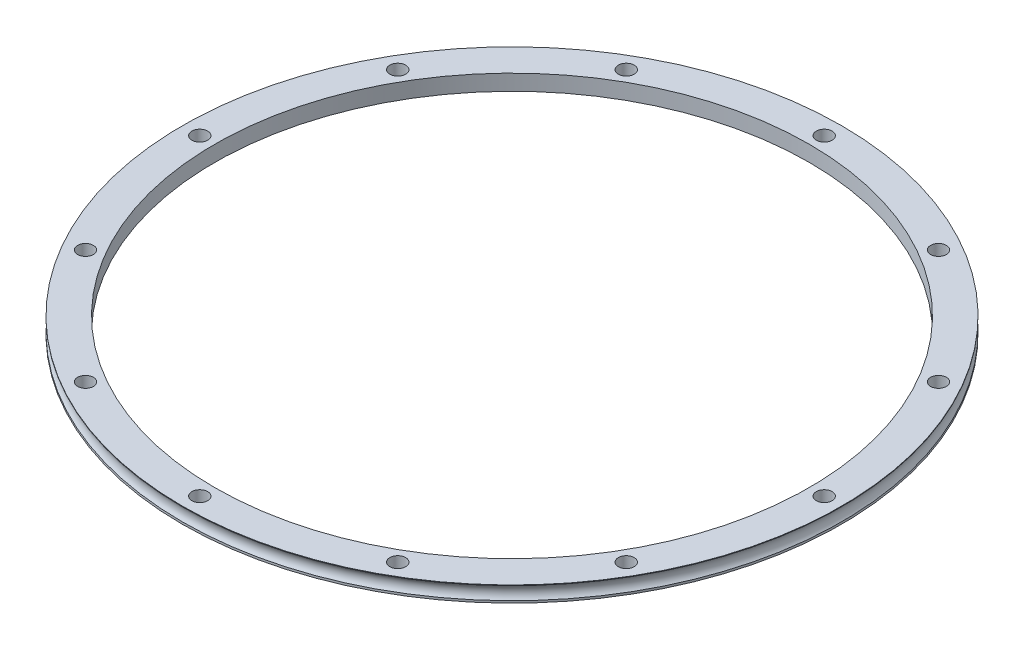
ISO-10303-21;
HEADER;
FILE_DESCRIPTION(('STEP AP214'),'2;1');
FILE_NAME('part.step','',(''),(''),'','','');
FILE_SCHEMA(('AUTOMOTIVE_DESIGN { 1 0 10303 214 1 1 1 1 }'));
ENDSEC;
DATA;
#1=APPLICATION_CONTEXT('core data for automotive mechanical design processes');
#2=APPLICATION_PROTOCOL_DEFINITION('international standard','automotive_design',2000,#1);
#3=PRODUCT_CONTEXT('',#1,'mechanical');
#4=PRODUCT('Part','Part','',(#3));
#5=PRODUCT_RELATED_PRODUCT_CATEGORY('part','',(#4));
#6=PRODUCT_DEFINITION_FORMATION('','',#4);
#7=PRODUCT_DEFINITION_CONTEXT('part definition',#1,'design');
#8=PRODUCT_DEFINITION('design','',#6,#7);
#9=PRODUCT_DEFINITION_SHAPE('','',#8);
#10=(LENGTH_UNIT() NAMED_UNIT(*) SI_UNIT(.MILLI.,.METRE.));
#11=(NAMED_UNIT(*) PLANE_ANGLE_UNIT() SI_UNIT($,.RADIAN.));
#12=(NAMED_UNIT(*) SI_UNIT($,.STERADIAN.) SOLID_ANGLE_UNIT());
#13=UNCERTAINTY_MEASURE_WITH_UNIT(LENGTH_MEASURE(1.E-05),#10,'distance_accuracy_value','');
#14=(GEOMETRIC_REPRESENTATION_CONTEXT(3) GLOBAL_UNCERTAINTY_ASSIGNED_CONTEXT((#13)) GLOBAL_UNIT_ASSIGNED_CONTEXT((#10,
#11,#12)) REPRESENTATION_CONTEXT('',''));
#15=CARTESIAN_POINT('',(0.,0.,0.));
#16=DIRECTION('',(0.,0.,1.));
#17=DIRECTION('',(1.,0.,0.));
#18=AXIS2_PLACEMENT_3D('',#15,#16,#17);
#19=CARTESIAN_POINT('',(0.,8.53500000000001,0.));
#20=DIRECTION('',(0.,-1.,0.));
#21=DIRECTION('',(0.,0.,-1.));
#22=AXIS2_PLACEMENT_3D('',#19,#20,#21);
#23=TOROIDAL_SURFACE('',#22,67.984375,1.984375);
#24=CARTESIAN_POINT('',(0.,7.21804328088638,0.));
#25=DIRECTION('',(0.,-1.,0.));
#26=DIRECTION('',(0.,0.,-1.));
#27=AXIS2_PLACEMENT_3D('',#24,#25,#26);
#28=CIRCLE('',#27,66.5);
#29=CARTESIAN_POINT('',(0.,7.21804328088638,-66.5));
#30=VERTEX_POINT('',#29);
#31=EDGE_CURVE('E10',#30,#30,#28,.T.);
#32=ORIENTED_EDGE('',*,*,#31,.F.);
#33=EDGE_LOOP('',(#32));
#34=FACE_BOUND('',#33,.T.);
#35=CARTESIAN_POINT('',(0.,9.85195671910333,0.));
#36=DIRECTION('',(0.,-1.,0.));
#37=DIRECTION('',(0.,0.,-1.));
#38=AXIS2_PLACEMENT_3D('',#35,#36,#37);
#39=CIRCLE('',#38,66.5);
#40=CARTESIAN_POINT('',(0.,9.85195671910333,-66.5));
#41=VERTEX_POINT('',#40);
#42=EDGE_CURVE('E59',#41,#41,#39,.T.);
#43=ORIENTED_EDGE('',*,*,#42,.T.);
#44=EDGE_LOOP('',(#43));
#45=FACE_BOUND('',#44,.T.);
#46=ADVANCED_FACE('F37',(#34,#45),#23,.F.);
#47=CARTESIAN_POINT('',(0.,-200069.047495165,0.));
#48=DIRECTION('',(0.,-1.,0.));
#49=DIRECTION('',(0.,0.,-1.));
#50=AXIS2_PLACEMENT_3D('',#47,#48,#49);
#51=CYLINDRICAL_SURFACE('',#50,66.5);
#52=CARTESIAN_POINT('',(0.,6.78500000000781,0.));
#53=DIRECTION('',(0.,-1.,0.));
#54=DIRECTION('',(0.,0.,-1.));
#55=AXIS2_PLACEMENT_3D('',#52,#53,#54);
#56=CIRCLE('',#55,66.5);
#57=CARTESIAN_POINT('',(0.,6.78500000000781,-66.5));
#58=VERTEX_POINT('',#57);
#59=EDGE_CURVE('E43',#58,#58,#56,.T.);
#60=ORIENTED_EDGE('',*,*,#59,.F.);
#61=EDGE_LOOP('',(#60));
#62=FACE_BOUND('',#61,.T.);
#63=ORIENTED_EDGE('',*,*,#31,.T.);
#64=EDGE_LOOP('',(#63));
#65=FACE_BOUND('',#64,.T.);
#66=ADVANCED_FACE('F169',(#62,#65),#51,.T.);
#67=CARTESIAN_POINT('',(-60.,6.785,0.));
#68=DIRECTION('',(0.,1.,0.));
#69=DIRECTION('',(0.,0.,1.));
#70=AXIS2_PLACEMENT_3D('',#67,#68,#69);
#71=PLANE('',#70);
#72=CARTESIAN_POINT('',(-54.5596004384197,6.78500000000781,-31.4999999999999));
#73=DIRECTION('',(0.,1.,0.));
#74=DIRECTION('',(0.86602540378444,0.,0.499999999999998));
#75=AXIS2_PLACEMENT_3D('',#72,#73,#74);
#76=CIRCLE('',#75,1.6);
#77=CARTESIAN_POINT('',(-53.1739597923646,6.78500000000781,-30.6999999999999));
#78=VERTEX_POINT('',#77);
#79=EDGE_CURVE('E72',#78,#78,#76,.T.);
#80=ORIENTED_EDGE('',*,*,#79,.T.);
#81=EDGE_LOOP('',(#80));
#82=FACE_BOUND('',#81,.T.);
#83=CARTESIAN_POINT('',(-63.,6.78500000000781,2.19963324347117E-13));
#84=DIRECTION('',(0.,1.,0.));
#85=DIRECTION('',(1.,0.,0.));
#86=AXIS2_PLACEMENT_3D('',#83,#84,#85);
#87=CIRCLE('',#86,1.6);
#88=CARTESIAN_POINT('',(-61.4,6.78500000000781,2.14376954204968E-13));
#89=VERTEX_POINT('',#88);
#90=EDGE_CURVE('E115',#89,#89,#87,.T.);
#91=ORIENTED_EDGE('',*,*,#90,.T.);
#92=EDGE_LOOP('',(#91));
#93=FACE_BOUND('',#92,.T.);
#94=CARTESIAN_POINT('',(-54.5596004384195,6.78500000000781,31.5000000000003));
#95=DIRECTION('',(0.,1.,0.));
#96=DIRECTION('',(0.866025403784436,0.,-0.500000000000004));
#97=AXIS2_PLACEMENT_3D('',#94,#95,#96);
#98=CIRCLE('',#97,1.6);
#99=CARTESIAN_POINT('',(-53.1739597923644,6.78500000000781,30.7000000000002));
#100=VERTEX_POINT('',#99);
#101=EDGE_CURVE('E109',#100,#100,#98,.T.);
#102=ORIENTED_EDGE('',*,*,#101,.T.);
#103=EDGE_LOOP('',(#102));
#104=FACE_BOUND('',#103,.T.);
#105=CARTESIAN_POINT('',(-31.4999999999997,6.78500000000781,54.5596004384198));
#106=DIRECTION('',(0.,1.,0.));
#107=DIRECTION('',(0.499999999999995,0.,-0.866025403784442));
#108=AXIS2_PLACEMENT_3D('',#105,#106,#107);
#109=CIRCLE('',#108,1.6);
#110=CARTESIAN_POINT('',(-30.6999999999997,6.78500000000781,53.1739597923647));
#111=VERTEX_POINT('',#110);
#112=EDGE_CURVE('E103',#111,#111,#109,.T.);
#113=ORIENTED_EDGE('',*,*,#112,.T.);
#114=EDGE_LOOP('',(#113));
#115=FACE_BOUND('',#114,.T.);
#116=CARTESIAN_POINT('',(0.,6.78500000000781,63.));
#117=DIRECTION('',(0.,1.,0.));
#118=DIRECTION('',(0.,0.,-1.));
#119=AXIS2_PLACEMENT_3D('',#116,#117,#118);
#120=CIRCLE('',#119,1.6);
#121=CARTESIAN_POINT('',(0.,6.78500000000781,61.4));
#122=VERTEX_POINT('',#121);
#123=EDGE_CURVE('E97',#122,#122,#120,.T.);
#124=ORIENTED_EDGE('',*,*,#123,.T.);
#125=EDGE_LOOP('',(#124));
#126=FACE_BOUND('',#125,.T.);
#127=CARTESIAN_POINT('',(31.5000000000005,6.78500000000781,54.5596004384194));
#128=DIRECTION('',(0.,1.,0.));
#129=DIRECTION('',(-0.500000000000007,0.,-0.866025403784435));
#130=AXIS2_PLACEMENT_3D('',#127,#128,#129);
#131=CIRCLE('',#130,1.6);
#132=CARTESIAN_POINT('',(30.7000000000004,6.78500000000781,53.1739597923643));
#133=VERTEX_POINT('',#132);
#134=EDGE_CURVE('E91',#133,#133,#131,.T.);
#135=ORIENTED_EDGE('',*,*,#134,.T.);
#136=EDGE_LOOP('',(#135));
#137=FACE_BOUND('',#136,.T.);
#138=CARTESIAN_POINT('',(54.5596004384199,6.78500000000781,31.4999999999995));
#139=DIRECTION('',(0.,1.,0.));
#140=DIRECTION('',(-0.866025403784443,0.,-0.499999999999992));
#141=AXIS2_PLACEMENT_3D('',#138,#139,#140);
#142=CIRCLE('',#141,1.6);
#143=CARTESIAN_POINT('',(53.1739597923648,6.78500000000781,30.6999999999995));
#144=VERTEX_POINT('',#143);
#145=EDGE_CURVE('E85',#144,#144,#142,.T.);
#146=ORIENTED_EDGE('',*,*,#145,.T.);
#147=EDGE_LOOP('',(#146));
#148=FACE_BOUND('',#147,.T.);
#149=CARTESIAN_POINT('',(63.,6.78500000000781,-6.59889973041352E-13));
#150=DIRECTION('',(0.,1.,0.));
#151=DIRECTION('',(-1.,0.,0.));
#152=AXIS2_PLACEMENT_3D('',#149,#150,#151);
#153=CIRCLE('',#152,1.6);
#154=CARTESIAN_POINT('',(61.4,6.78500000000781,-6.43130862614905E-13));
#155=VERTEX_POINT('',#154);
#156=EDGE_CURVE('E78',#155,#155,#153,.T.);
#157=ORIENTED_EDGE('',*,*,#156,.T.);
#158=EDGE_LOOP('',(#157));
#159=FACE_BOUND('',#158,.T.);
#160=CARTESIAN_POINT('',(54.5596004384193,6.78500000000781,-31.5000000000006));
#161=DIRECTION('',(0.,1.,0.));
#162=DIRECTION('',(-0.866025403784433,0.,0.50000000000001));
#163=AXIS2_PLACEMENT_3D('',#160,#161,#162);
#164=CIRCLE('',#163,1.6);
#165=CARTESIAN_POINT('',(53.1739597923642,6.78500000000781,-30.7000000000006));
#166=VERTEX_POINT('',#165);
#167=EDGE_CURVE('E79',#166,#166,#164,.T.);
#168=ORIENTED_EDGE('',*,*,#167,.T.);
#169=EDGE_LOOP('',(#168));
#170=FACE_BOUND('',#169,.T.);
#171=CARTESIAN_POINT('',(31.4999999999993,6.78500000000781,-54.55960043842));
#172=DIRECTION('',(0.,1.,0.));
#173=DIRECTION('',(-0.499999999999989,0.,0.866025403784445));
#174=AXIS2_PLACEMENT_3D('',#171,#172,#173);
#175=CIRCLE('',#174,1.6);
#176=CARTESIAN_POINT('',(30.6999999999993,6.78500000000781,-53.1739597923649));
#177=VERTEX_POINT('',#176);
#178=EDGE_CURVE('E126',#177,#177,#175,.T.);
#179=ORIENTED_EDGE('',*,*,#178,.T.);
#180=EDGE_LOOP('',(#179));
#181=FACE_BOUND('',#180,.T.);
#182=CARTESIAN_POINT('',(-31.5000000000001,6.78500000000781,-54.5596004384196));
#183=DIRECTION('',(0.,1.,0.));
#184=DIRECTION('',(0.500000000000001,0.,0.866025403784438));
#185=AXIS2_PLACEMENT_3D('',#182,#183,#184);
#186=CIRCLE('',#185,1.6);
#187=CARTESIAN_POINT('',(-30.7000000000001,6.78500000000781,-53.1739597923645));
#188=VERTEX_POINT('',#187);
#189=EDGE_CURVE('E66',#188,#188,#186,.T.);
#190=ORIENTED_EDGE('',*,*,#189,.T.);
#191=EDGE_LOOP('',(#190));
#192=FACE_BOUND('',#191,.T.);
#193=CARTESIAN_POINT('',(0.,6.78500000000781,-63.));
#194=DIRECTION('',(0.,1.,0.));
#195=DIRECTION('',(0.,0.,1.));
#196=AXIS2_PLACEMENT_3D('',#193,#194,#195);
#197=CIRCLE('',#196,1.6);
#198=CARTESIAN_POINT('',(0.,6.78500000000781,-61.4));
#199=VERTEX_POINT('',#198);
#200=EDGE_CURVE('E62',#199,#199,#197,.T.);
#201=ORIENTED_EDGE('',*,*,#200,.T.);
#202=EDGE_LOOP('',(#201));
#203=FACE_BOUND('',#202,.T.);
#204=CARTESIAN_POINT('',(0.,6.78500000000781,0.));
#205=DIRECTION('',(0.,-1.,0.));
#206=DIRECTION('',(0.,0.,-1.));
#207=AXIS2_PLACEMENT_3D('',#204,#205,#206);
#208=CIRCLE('',#207,60.);
#209=CARTESIAN_POINT('',(0.,6.78500000000781,-60.));
#210=VERTEX_POINT('',#209);
#211=EDGE_CURVE('E47',#210,#210,#208,.T.);
#212=ORIENTED_EDGE('',*,*,#211,.F.);
#213=EDGE_LOOP('',(#212));
#214=FACE_BOUND('',#213,.T.);
#215=ORIENTED_EDGE('',*,*,#59,.T.);
#216=EDGE_LOOP('',(#215));
#217=FACE_BOUND('',#216,.T.);
#218=ADVANCED_FACE('F135',(#82,#93,#104,#115,#126,#137,#148,#159,#170,#181,#192,#203,#214,#217),
#71,.F.);
#219=CARTESIAN_POINT('',(0.,-200069.047495165,0.));
#220=DIRECTION('',(0.,-1.,0.));
#221=DIRECTION('',(0.,0.,-1.));
#222=AXIS2_PLACEMENT_3D('',#219,#220,#221);
#223=CYLINDRICAL_SURFACE('',#222,60.);
#224=CARTESIAN_POINT('',(0.,9.96499999999401,0.));
#225=DIRECTION('',(0.,-1.,0.));
#226=DIRECTION('',(0.,0.,-1.));
#227=AXIS2_PLACEMENT_3D('',#224,#225,#226);
#228=CIRCLE('',#227,60.);
#229=CARTESIAN_POINT('',(0.,9.96499999999401,-60.));
#230=VERTEX_POINT('',#229);
#231=EDGE_CURVE('E51',#230,#230,#228,.T.);
#232=ORIENTED_EDGE('',*,*,#231,.F.);
#233=EDGE_LOOP('',(#232));
#234=FACE_BOUND('',#233,.T.);
#235=ORIENTED_EDGE('',*,*,#211,.T.);
#236=EDGE_LOOP('',(#235));
#237=FACE_BOUND('',#236,.T.);
#238=ADVANCED_FACE('F150',(#234,#237),#223,.F.);
#239=CARTESIAN_POINT('',(-60.,9.965,0.));
#240=DIRECTION('',(0.,-1.,0.));
#241=DIRECTION('',(0.,0.,-1.));
#242=AXIS2_PLACEMENT_3D('',#239,#240,#241);
#243=PLANE('',#242);
#244=CARTESIAN_POINT('',(-54.5596004384197,9.965,-31.4999999999999));
#245=DIRECTION('',(0.,1.,0.));
#246=DIRECTION('',(0.86602540378444,0.,0.499999999999998));
#247=AXIS2_PLACEMENT_3D('',#244,#245,#246);
#248=CIRCLE('',#247,1.6);
#249=CARTESIAN_POINT('',(-53.1739597923646,9.965,-30.6999999999999));
#250=VERTEX_POINT('',#249);
#251=EDGE_CURVE('E118',#250,#250,#248,.T.);
#252=ORIENTED_EDGE('',*,*,#251,.F.);
#253=EDGE_LOOP('',(#252));
#254=FACE_BOUND('',#253,.T.);
#255=CARTESIAN_POINT('',(-63.,9.965,2.19963324347117E-13));
#256=DIRECTION('',(0.,1.,0.));
#257=DIRECTION('',(1.,0.,0.));
#258=AXIS2_PLACEMENT_3D('',#255,#256,#257);
#259=CIRCLE('',#258,1.6);
#260=CARTESIAN_POINT('',(-61.4,9.965,2.14376954204968E-13));
#261=VERTEX_POINT('',#260);
#262=EDGE_CURVE('E112',#261,#261,#259,.T.);
#263=ORIENTED_EDGE('',*,*,#262,.F.);
#264=EDGE_LOOP('',(#263));
#265=FACE_BOUND('',#264,.T.);
#266=CARTESIAN_POINT('',(-54.5596004384195,9.965,31.5000000000003));
#267=DIRECTION('',(0.,1.,0.));
#268=DIRECTION('',(0.866025403784436,0.,-0.500000000000004));
#269=AXIS2_PLACEMENT_3D('',#266,#267,#268);
#270=CIRCLE('',#269,1.6);
#271=CARTESIAN_POINT('',(-53.1739597923644,9.965,30.7000000000002));
#272=VERTEX_POINT('',#271);
#273=EDGE_CURVE('E106',#272,#272,#270,.T.);
#274=ORIENTED_EDGE('',*,*,#273,.F.);
#275=EDGE_LOOP('',(#274));
#276=FACE_BOUND('',#275,.T.);
#277=CARTESIAN_POINT('',(-31.4999999999997,9.965,54.5596004384198));
#278=DIRECTION('',(0.,1.,0.));
#279=DIRECTION('',(0.499999999999995,0.,-0.866025403784442));
#280=AXIS2_PLACEMENT_3D('',#277,#278,#279);
#281=CIRCLE('',#280,1.6);
#282=CARTESIAN_POINT('',(-30.6999999999997,9.965,53.1739597923647));
#283=VERTEX_POINT('',#282);
#284=EDGE_CURVE('E100',#283,#283,#281,.T.);
#285=ORIENTED_EDGE('',*,*,#284,.F.);
#286=EDGE_LOOP('',(#285));
#287=FACE_BOUND('',#286,.T.);
#288=CARTESIAN_POINT('',(0.,9.965,63.));
#289=DIRECTION('',(0.,1.,0.));
#290=DIRECTION('',(0.,0.,-1.));
#291=AXIS2_PLACEMENT_3D('',#288,#289,#290);
#292=CIRCLE('',#291,1.6);
#293=CARTESIAN_POINT('',(0.,9.965,61.4));
#294=VERTEX_POINT('',#293);
#295=EDGE_CURVE('E94',#294,#294,#292,.T.);
#296=ORIENTED_EDGE('',*,*,#295,.F.);
#297=EDGE_LOOP('',(#296));
#298=FACE_BOUND('',#297,.T.);
#299=CARTESIAN_POINT('',(31.5000000000005,9.965,54.5596004384194));
#300=DIRECTION('',(0.,1.,0.));
#301=DIRECTION('',(-0.500000000000007,0.,-0.866025403784435));
#302=AXIS2_PLACEMENT_3D('',#299,#300,#301);
#303=CIRCLE('',#302,1.6);
#304=CARTESIAN_POINT('',(30.7000000000004,9.965,53.1739597923643));
#305=VERTEX_POINT('',#304);
#306=EDGE_CURVE('E88',#305,#305,#303,.T.);
#307=ORIENTED_EDGE('',*,*,#306,.F.);
#308=EDGE_LOOP('',(#307));
#309=FACE_BOUND('',#308,.T.);
#310=CARTESIAN_POINT('',(54.5596004384199,9.965,31.4999999999995));
#311=DIRECTION('',(0.,1.,0.));
#312=DIRECTION('',(-0.866025403784443,0.,-0.499999999999992));
#313=AXIS2_PLACEMENT_3D('',#310,#311,#312);
#314=CIRCLE('',#313,1.6);
#315=CARTESIAN_POINT('',(53.1739597923648,9.965,30.6999999999995));
#316=VERTEX_POINT('',#315);
#317=EDGE_CURVE('E82',#316,#316,#314,.T.);
#318=ORIENTED_EDGE('',*,*,#317,.F.);
#319=EDGE_LOOP('',(#318));
#320=FACE_BOUND('',#319,.T.);
#321=CARTESIAN_POINT('',(63.,9.965,-6.59889973041352E-13));
#322=DIRECTION('',(0.,1.,0.));
#323=DIRECTION('',(-1.,0.,0.));
#324=AXIS2_PLACEMENT_3D('',#321,#322,#323);
#325=CIRCLE('',#324,1.6);
#326=CARTESIAN_POINT('',(61.4,9.965,-6.43130862614905E-13));
#327=VERTEX_POINT('',#326);
#328=EDGE_CURVE('E75',#327,#327,#325,.T.);
#329=ORIENTED_EDGE('',*,*,#328,.F.);
#330=EDGE_LOOP('',(#329));
#331=FACE_BOUND('',#330,.T.);
#332=CARTESIAN_POINT('',(54.5596004384193,9.965,-31.5000000000006));
#333=DIRECTION('',(0.,1.,0.));
#334=DIRECTION('',(-0.866025403784433,0.,0.50000000000001));
#335=AXIS2_PLACEMENT_3D('',#332,#333,#334);
#336=CIRCLE('',#335,1.6);
#337=CARTESIAN_POINT('',(53.1739597923642,9.965,-30.7000000000006));
#338=VERTEX_POINT('',#337);
#339=EDGE_CURVE('E129',#338,#338,#336,.T.);
#340=ORIENTED_EDGE('',*,*,#339,.F.);
#341=EDGE_LOOP('',(#340));
#342=FACE_BOUND('',#341,.T.);
#343=CARTESIAN_POINT('',(31.4999999999993,9.965,-54.55960043842));
#344=DIRECTION('',(0.,1.,0.));
#345=DIRECTION('',(-0.499999999999989,0.,0.866025403784445));
#346=AXIS2_PLACEMENT_3D('',#343,#344,#345);
#347=CIRCLE('',#346,1.6);
#348=CARTESIAN_POINT('',(30.6999999999993,9.965,-53.1739597923649));
#349=VERTEX_POINT('',#348);
#350=EDGE_CURVE('E123',#349,#349,#347,.T.);
#351=ORIENTED_EDGE('',*,*,#350,.F.);
#352=EDGE_LOOP('',(#351));
#353=FACE_BOUND('',#352,.T.);
#354=CARTESIAN_POINT('',(-31.5000000000001,9.965,-54.5596004384196));
#355=DIRECTION('',(0.,1.,0.));
#356=DIRECTION('',(0.500000000000001,0.,0.866025403784438));
#357=AXIS2_PLACEMENT_3D('',#354,#355,#356);
#358=CIRCLE('',#357,1.6);
#359=CARTESIAN_POINT('',(-30.7000000000001,9.965,-53.1739597923645));
#360=VERTEX_POINT('',#359);
#361=EDGE_CURVE('E69',#360,#360,#358,.T.);
#362=ORIENTED_EDGE('',*,*,#361,.F.);
#363=EDGE_LOOP('',(#362));
#364=FACE_BOUND('',#363,.T.);
#365=CARTESIAN_POINT('',(0.,9.965,-63.));
#366=DIRECTION('',(0.,1.,0.));
#367=DIRECTION('',(0.,0.,1.));
#368=AXIS2_PLACEMENT_3D('',#365,#366,#367);
#369=CIRCLE('',#368,1.6);
#370=CARTESIAN_POINT('',(0.,9.965,-61.4));
#371=VERTEX_POINT('',#370);
#372=EDGE_CURVE('E63',#371,#371,#369,.T.);
#373=ORIENTED_EDGE('',*,*,#372,.F.);
#374=EDGE_LOOP('',(#373));
#375=FACE_BOUND('',#374,.T.);
#376=CARTESIAN_POINT('',(0.,9.96499999999401,0.));
#377=DIRECTION('',(0.,-1.,0.));
#378=DIRECTION('',(0.,0.,-1.));
#379=AXIS2_PLACEMENT_3D('',#376,#377,#378);
#380=CIRCLE('',#379,66.5);
#381=CARTESIAN_POINT('',(0.,9.96499999999401,-66.5));
#382=VERTEX_POINT('',#381);
#383=EDGE_CURVE('E56',#382,#382,#380,.T.);
#384=ORIENTED_EDGE('',*,*,#383,.F.);
#385=EDGE_LOOP('',(#384));
#386=FACE_BOUND('',#385,.T.);
#387=ORIENTED_EDGE('',*,*,#231,.T.);
#388=EDGE_LOOP('',(#387));
#389=FACE_BOUND('',#388,.T.);
#390=ADVANCED_FACE('F146',(#254,#265,#276,#287,#298,#309,#320,#331,#342,#353,#364,#375,#386,
#389),#243,.F.);
#391=CARTESIAN_POINT('',(0.,-200069.047495165,0.));
#392=DIRECTION('',(0.,-1.,0.));
#393=DIRECTION('',(0.,0.,-1.));
#394=AXIS2_PLACEMENT_3D('',#391,#392,#393);
#395=CYLINDRICAL_SURFACE('',#394,66.5);
#396=ORIENTED_EDGE('',*,*,#42,.F.);
#397=EDGE_LOOP('',(#396));
#398=FACE_BOUND('',#397,.T.);
#399=ORIENTED_EDGE('',*,*,#383,.T.);
#400=EDGE_LOOP('',(#399));
#401=FACE_BOUND('',#400,.T.);
#402=ADVANCED_FACE('F149',(#398,#401),#395,.T.);
#403=CARTESIAN_POINT('',(0.,6.78500000000781,-63.));
#404=DIRECTION('',(0.,1.,0.));
#405=DIRECTION('',(0.,0.,1.));
#406=AXIS2_PLACEMENT_3D('',#403,#404,#405);
#407=CYLINDRICAL_SURFACE('',#406,1.6);
#408=ORIENTED_EDGE('',*,*,#200,.F.);
#409=EDGE_LOOP('',(#408));
#410=FACE_BOUND('',#409,.T.);
#411=ORIENTED_EDGE('',*,*,#372,.T.);
#412=EDGE_LOOP('',(#411));
#413=FACE_BOUND('',#412,.T.);
#414=ADVANCED_FACE('F187',(#410,#413),#407,.F.);
#415=CARTESIAN_POINT('',(-31.5000000000001,6.78500000000781,-54.5596004384196));
#416=DIRECTION('',(0.,1.,0.));
#417=DIRECTION('',(0.,0.,1.));
#418=AXIS2_PLACEMENT_3D('',#415,#416,#417);
#419=CYLINDRICAL_SURFACE('',#418,1.6);
#420=ORIENTED_EDGE('',*,*,#189,.F.);
#421=EDGE_LOOP('',(#420));
#422=FACE_BOUND('',#421,.T.);
#423=ORIENTED_EDGE('',*,*,#361,.T.);
#424=EDGE_LOOP('',(#423));
#425=FACE_BOUND('',#424,.T.);
#426=ADVANCED_FACE('F191',(#422,#425),#419,.F.);
#427=CARTESIAN_POINT('',(31.4999999999993,6.78500000000781,-54.55960043842));
#428=DIRECTION('',(0.,1.,0.));
#429=DIRECTION('',(0.,0.,1.));
#430=AXIS2_PLACEMENT_3D('',#427,#428,#429);
#431=CYLINDRICAL_SURFACE('',#430,1.6);
#432=ORIENTED_EDGE('',*,*,#178,.F.);
#433=EDGE_LOOP('',(#432));
#434=FACE_BOUND('',#433,.T.);
#435=ORIENTED_EDGE('',*,*,#350,.T.);
#436=EDGE_LOOP('',(#435));
#437=FACE_BOUND('',#436,.T.);
#438=ADVANCED_FACE('F142',(#434,#437),#431,.F.);
#439=CARTESIAN_POINT('',(54.5596004384193,6.78500000000781,-31.5000000000006));
#440=DIRECTION('',(0.,1.,0.));
#441=DIRECTION('',(0.,0.,1.));
#442=AXIS2_PLACEMENT_3D('',#439,#440,#441);
#443=CYLINDRICAL_SURFACE('',#442,1.6);
#444=ORIENTED_EDGE('',*,*,#167,.F.);
#445=EDGE_LOOP('',(#444));
#446=FACE_BOUND('',#445,.T.);
#447=ORIENTED_EDGE('',*,*,#339,.T.);
#448=EDGE_LOOP('',(#447));
#449=FACE_BOUND('',#448,.T.);
#450=ADVANCED_FACE('F138',(#446,#449),#443,.F.);
#451=CARTESIAN_POINT('',(63.,6.78500000000781,-6.59889973041352E-13));
#452=DIRECTION('',(0.,1.,0.));
#453=DIRECTION('',(0.,0.,1.));
#454=AXIS2_PLACEMENT_3D('',#451,#452,#453);
#455=CYLINDRICAL_SURFACE('',#454,1.6);
#456=ORIENTED_EDGE('',*,*,#156,.F.);
#457=EDGE_LOOP('',(#456));
#458=FACE_BOUND('',#457,.T.);
#459=ORIENTED_EDGE('',*,*,#328,.T.);
#460=EDGE_LOOP('',(#459));
#461=FACE_BOUND('',#460,.T.);
#462=ADVANCED_FACE('F141',(#458,#461),#455,.F.);
#463=CARTESIAN_POINT('',(54.5596004384199,6.78500000000781,31.4999999999995));
#464=DIRECTION('',(0.,1.,0.));
#465=DIRECTION('',(0.,0.,1.));
#466=AXIS2_PLACEMENT_3D('',#463,#464,#465);
#467=CYLINDRICAL_SURFACE('',#466,1.6);
#468=ORIENTED_EDGE('',*,*,#145,.F.);
#469=EDGE_LOOP('',(#468));
#470=FACE_BOUND('',#469,.T.);
#471=ORIENTED_EDGE('',*,*,#317,.T.);
#472=EDGE_LOOP('',(#471));
#473=FACE_BOUND('',#472,.T.);
#474=ADVANCED_FACE('F200',(#470,#473),#467,.F.);
#475=CARTESIAN_POINT('',(31.5000000000005,6.78500000000781,54.5596004384194));
#476=DIRECTION('',(0.,1.,0.));
#477=DIRECTION('',(0.,0.,1.));
#478=AXIS2_PLACEMENT_3D('',#475,#476,#477);
#479=CYLINDRICAL_SURFACE('',#478,1.6);
#480=ORIENTED_EDGE('',*,*,#134,.F.);
#481=EDGE_LOOP('',(#480));
#482=FACE_BOUND('',#481,.T.);
#483=ORIENTED_EDGE('',*,*,#306,.T.);
#484=EDGE_LOOP('',(#483));
#485=FACE_BOUND('',#484,.T.);
#486=ADVANCED_FACE('F204',(#482,#485),#479,.F.);
#487=CARTESIAN_POINT('',(0.,6.78500000000781,63.));
#488=DIRECTION('',(0.,1.,0.));
#489=DIRECTION('',(0.,0.,1.));
#490=AXIS2_PLACEMENT_3D('',#487,#488,#489);
#491=CYLINDRICAL_SURFACE('',#490,1.6);
#492=ORIENTED_EDGE('',*,*,#123,.F.);
#493=EDGE_LOOP('',(#492));
#494=FACE_BOUND('',#493,.T.);
#495=ORIENTED_EDGE('',*,*,#295,.T.);
#496=EDGE_LOOP('',(#495));
#497=FACE_BOUND('',#496,.T.);
#498=ADVANCED_FACE('F208',(#494,#497),#491,.F.);
#499=CARTESIAN_POINT('',(-31.4999999999997,6.78500000000781,54.5596004384198));
#500=DIRECTION('',(0.,1.,0.));
#501=DIRECTION('',(0.,0.,1.));
#502=AXIS2_PLACEMENT_3D('',#499,#500,#501);
#503=CYLINDRICAL_SURFACE('',#502,1.6);
#504=ORIENTED_EDGE('',*,*,#112,.F.);
#505=EDGE_LOOP('',(#504));
#506=FACE_BOUND('',#505,.T.);
#507=ORIENTED_EDGE('',*,*,#284,.T.);
#508=EDGE_LOOP('',(#507));
#509=FACE_BOUND('',#508,.T.);
#510=ADVANCED_FACE('F212',(#506,#509),#503,.F.);
#511=CARTESIAN_POINT('',(-54.5596004384195,6.78500000000781,31.5000000000003));
#512=DIRECTION('',(0.,1.,0.));
#513=DIRECTION('',(0.,0.,1.));
#514=AXIS2_PLACEMENT_3D('',#511,#512,#513);
#515=CYLINDRICAL_SURFACE('',#514,1.6);
#516=ORIENTED_EDGE('',*,*,#101,.F.);
#517=EDGE_LOOP('',(#516));
#518=FACE_BOUND('',#517,.T.);
#519=ORIENTED_EDGE('',*,*,#273,.T.);
#520=EDGE_LOOP('',(#519));
#521=FACE_BOUND('',#520,.T.);
#522=ADVANCED_FACE('F216',(#518,#521),#515,.F.);
#523=CARTESIAN_POINT('',(-63.,6.78500000000781,2.19963324347117E-13));
#524=DIRECTION('',(0.,1.,0.));
#525=DIRECTION('',(0.,0.,1.));
#526=AXIS2_PLACEMENT_3D('',#523,#524,#525);
#527=CYLINDRICAL_SURFACE('',#526,1.6);
#528=ORIENTED_EDGE('',*,*,#90,.F.);
#529=EDGE_LOOP('',(#528));
#530=FACE_BOUND('',#529,.T.);
#531=ORIENTED_EDGE('',*,*,#262,.T.);
#532=EDGE_LOOP('',(#531));
#533=FACE_BOUND('',#532,.T.);
#534=ADVANCED_FACE('F220',(#530,#533),#527,.F.);
#535=CARTESIAN_POINT('',(-54.5596004384197,6.78500000000781,-31.4999999999999));
#536=DIRECTION('',(0.,1.,0.));
#537=DIRECTION('',(0.,0.,1.));
#538=AXIS2_PLACEMENT_3D('',#535,#536,#537);
#539=CYLINDRICAL_SURFACE('',#538,1.6);
#540=ORIENTED_EDGE('',*,*,#79,.F.);
#541=EDGE_LOOP('',(#540));
#542=FACE_BOUND('',#541,.T.);
#543=ORIENTED_EDGE('',*,*,#251,.T.);
#544=EDGE_LOOP('',(#543));
#545=FACE_BOUND('',#544,.T.);
#546=ADVANCED_FACE('F224',(#542,#545),#539,.F.);
#547=CLOSED_SHELL('',(#46,#66,#218,#238,#390,#402,#414,#426,#438,#450,#462,#474,#486,#498,#510,
#522,#534,#546));
#548=MANIFOLD_SOLID_BREP('B2',#547);
#549=ADVANCED_BREP_SHAPE_REPRESENTATION('',(#18,#548),#14);
#550=SHAPE_DEFINITION_REPRESENTATION(#9,#549);
ENDSEC;
END-ISO-10303-21;
